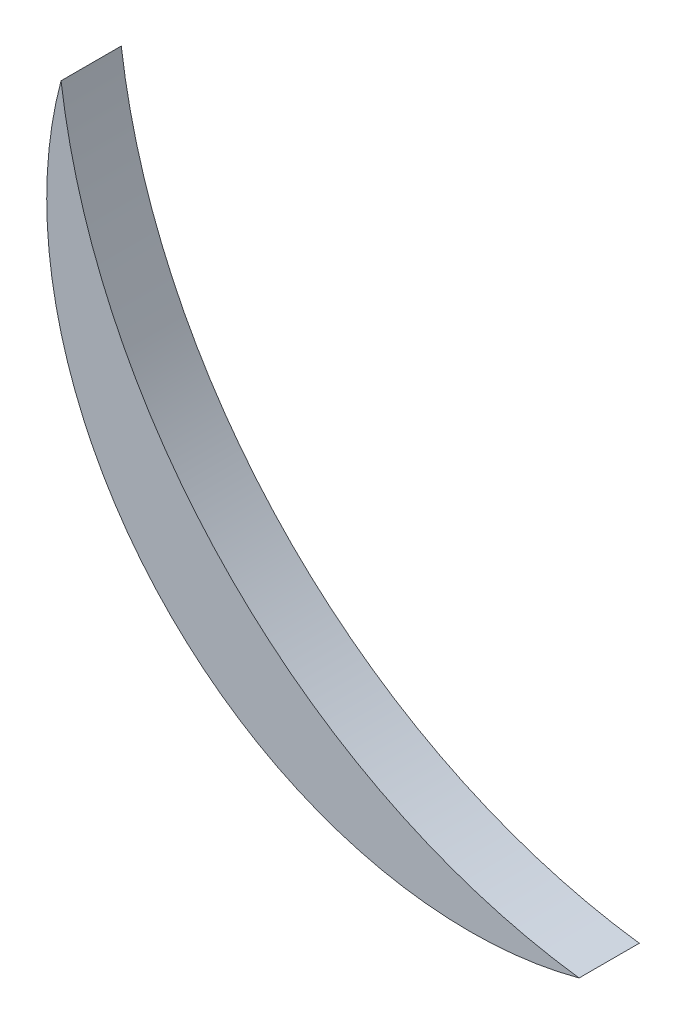
ISO-10303-21;
HEADER;
FILE_DESCRIPTION(('STEP AP214'),'2;1');
FILE_NAME('part.step','',(''),(''),'','','');
FILE_SCHEMA(('AUTOMOTIVE_DESIGN { 1 0 10303 214 1 1 1 1 }'));
ENDSEC;
DATA;
#1=APPLICATION_CONTEXT('core data for automotive mechanical design processes');
#2=APPLICATION_PROTOCOL_DEFINITION('international standard','automotive_design',2000,#1);
#3=PRODUCT_CONTEXT('',#1,'mechanical');
#4=PRODUCT('Part','Part','',(#3));
#5=PRODUCT_RELATED_PRODUCT_CATEGORY('part','',(#4));
#6=PRODUCT_DEFINITION_FORMATION('','',#4);
#7=PRODUCT_DEFINITION_CONTEXT('part definition',#1,'design');
#8=PRODUCT_DEFINITION('design','',#6,#7);
#9=PRODUCT_DEFINITION_SHAPE('','',#8);
#10=(LENGTH_UNIT() NAMED_UNIT(*) SI_UNIT(.MILLI.,.METRE.));
#11=(NAMED_UNIT(*) PLANE_ANGLE_UNIT() SI_UNIT($,.RADIAN.));
#12=(NAMED_UNIT(*) SI_UNIT($,.STERADIAN.) SOLID_ANGLE_UNIT());
#13=UNCERTAINTY_MEASURE_WITH_UNIT(LENGTH_MEASURE(1.E-05),#10,'distance_accuracy_value','');
#14=(GEOMETRIC_REPRESENTATION_CONTEXT(3) GLOBAL_UNCERTAINTY_ASSIGNED_CONTEXT((#13)) GLOBAL_UNIT_ASSIGNED_CONTEXT((#10,
#11,#12)) REPRESENTATION_CONTEXT('',''));
#15=CARTESIAN_POINT('',(0.,0.,0.));
#16=DIRECTION('',(0.,0.,1.));
#17=DIRECTION('',(1.,0.,0.));
#18=AXIS2_PLACEMENT_3D('',#15,#16,#17);
#19=CARTESIAN_POINT('',(50.67887756,85.95102952,0.));
#20=DIRECTION('',(0.,0.,-1.));
#21=DIRECTION('',(1.,0.,0.));
#22=AXIS2_PLACEMENT_3D('',#19,#20,#21);
#23=CYLINDRICAL_SURFACE('',#22,0.3556);
#24=DIRECTION('',(0.,0.,1.));
#25=VECTOR('',#24,1.);
#26=CARTESIAN_POINT('',(50.3263300977978,85.9045360054542,0.));
#27=LINE('',#26,#25);
#28=CARTESIAN_POINT('',(50.3263300977978,85.9045360054542,0.));
#29=VERTEX_POINT('',#28);
#30=CARTESIAN_POINT('',(50.3263300977978,85.9045360054542,0.03556));
#31=VERTEX_POINT('',#30);
#32=EDGE_CURVE('E11',#29,#31,#27,.T.);
#33=ORIENTED_EDGE('',*,*,#32,.T.);
#34=CARTESIAN_POINT('',(50.67887756,85.95102952,0.03556));
#35=DIRECTION('',(0.,0.,1.));
#36=DIRECTION('',(1.,0.,0.));
#37=AXIS2_PLACEMENT_3D('',#34,#35,#36);
#38=CIRCLE('',#37,0.3556);
#39=CARTESIAN_POINT('',(50.6323840454542,85.5984820577978,0.03556));
#40=VERTEX_POINT('',#39);
#41=EDGE_CURVE('E24',#31,#40,#38,.T.);
#42=ORIENTED_EDGE('',*,*,#41,.T.);
#43=DIRECTION('',(0.,0.,1.));
#44=VECTOR('',#43,1.);
#45=CARTESIAN_POINT('',(50.6323840454542,85.5984820577978,0.));
#46=LINE('',#45,#44);
#47=CARTESIAN_POINT('',(50.6323840454542,85.5984820577978,0.));
#48=VERTEX_POINT('',#47);
#49=EDGE_CURVE('E40',#48,#40,#46,.T.);
#50=ORIENTED_EDGE('',*,*,#49,.F.);
#51=CARTESIAN_POINT('',(50.67887756,85.95102952,0.));
#52=DIRECTION('',(0.,0.,1.));
#53=DIRECTION('',(1.,0.,0.));
#54=AXIS2_PLACEMENT_3D('',#51,#52,#53);
#55=CIRCLE('',#54,0.3556);
#56=EDGE_CURVE('E42',#29,#48,#55,.T.);
#57=ORIENTED_EDGE('',*,*,#56,.F.);
#58=EDGE_LOOP('',(#33,#42,#50,#57));
#59=FACE_BOUND('',#58,.T.);
#60=ADVANCED_FACE('F17',(#59),#23,.F.);
#61=CARTESIAN_POINT('',(50.56785924,85.8400112,0.));
#62=DIRECTION('',(0.,0.,-1.));
#63=DIRECTION('',(-0.707106781186533,0.707106781186562,0.));
#64=AXIS2_PLACEMENT_3D('',#61,#62,#63);
#65=CYLINDRICAL_SURFACE('',#64,0.249999554103218);
#66=CARTESIAN_POINT('',(50.56785924,85.8400112,0.03556));
#67=DIRECTION('',(0.,0.,1.));
#68=DIRECTION('',(-0.707106781186533,0.707106781186562,0.));
#69=AXIS2_PLACEMENT_3D('',#66,#67,#68);
#70=CIRCLE('',#69,0.249999554103218);
#71=EDGE_CURVE('E49',#31,#40,#70,.T.);
#72=ORIENTED_EDGE('',*,*,#71,.F.);
#73=ORIENTED_EDGE('',*,*,#32,.F.);
#74=CARTESIAN_POINT('',(50.56785924,85.8400112,0.));
#75=DIRECTION('',(0.,0.,1.));
#76=DIRECTION('',(-0.707106781186533,0.707106781186562,0.));
#77=AXIS2_PLACEMENT_3D('',#74,#75,#76);
#78=CIRCLE('',#77,0.249999554103218);
#79=EDGE_CURVE('E48',#29,#48,#78,.T.);
#80=ORIENTED_EDGE('',*,*,#79,.T.);
#81=ORIENTED_EDGE('',*,*,#49,.T.);
#82=EDGE_LOOP('',(#72,#73,#80,#81));
#83=FACE_BOUND('',#82,.T.);
#84=ADVANCED_FACE('F51',(#83),#65,.T.);
#85=CARTESIAN_POINT('',(50.74463562,85.66323482,0.));
#86=DIRECTION('',(0.,0.,-1.));
#87=DIRECTION('',(-1.,0.,0.));
#88=AXIS2_PLACEMENT_3D('',#85,#86,#87);
#89=PLANE('',#88);
#90=ORIENTED_EDGE('',*,*,#56,.T.);
#91=ORIENTED_EDGE('',*,*,#79,.F.);
#92=EDGE_LOOP('',(#90,#91));
#93=FACE_BOUND('',#92,.T.);
#94=ADVANCED_FACE('F47',(#93),#89,.T.);
#95=CARTESIAN_POINT('',(50.74463562,85.66323482,0.03556));
#96=DIRECTION('',(0.,0.,-1.));
#97=DIRECTION('',(-1.,0.,0.));
#98=AXIS2_PLACEMENT_3D('',#95,#96,#97);
#99=PLANE('',#98);
#100=ORIENTED_EDGE('',*,*,#71,.T.);
#101=ORIENTED_EDGE('',*,*,#41,.F.);
#102=EDGE_LOOP('',(#100,#101));
#103=FACE_BOUND('',#102,.T.);
#104=ADVANCED_FACE('F55',(#103),#99,.F.);
#105=CLOSED_SHELL('',(#60,#84,#94,#104));
#106=MANIFOLD_SOLID_BREP('B1',#105);
#107=ADVANCED_BREP_SHAPE_REPRESENTATION('',(#18,#106),#14);
#108=SHAPE_DEFINITION_REPRESENTATION(#9,#107);
ENDSEC;
END-ISO-10303-21;
